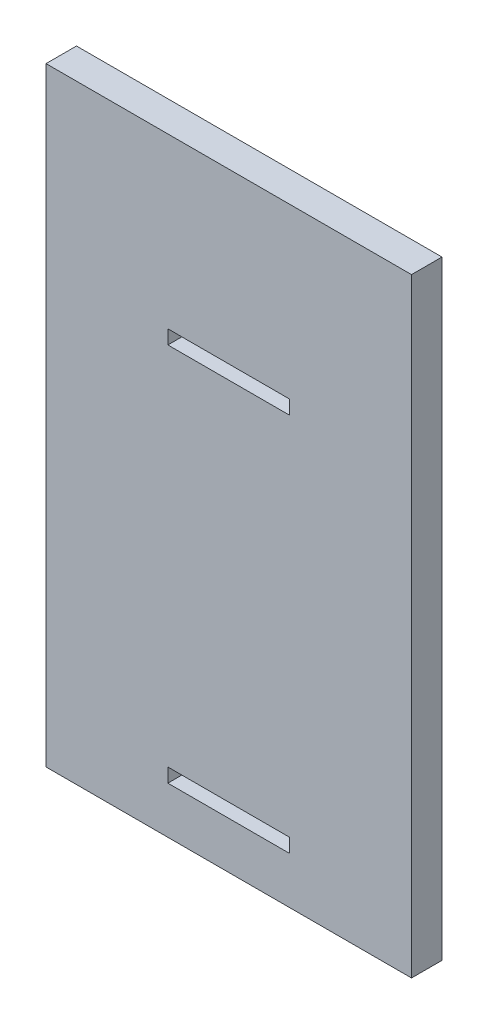
ISO-10303-21;
HEADER;
FILE_DESCRIPTION(('STEP AP214'),'2;1');
FILE_NAME('part.step','',(''),(''),'','','');
FILE_SCHEMA(('AUTOMOTIVE_DESIGN { 1 0 10303 214 1 1 1 1 }'));
ENDSEC;
DATA;
#1=APPLICATION_CONTEXT('core data for automotive mechanical design processes');
#2=APPLICATION_PROTOCOL_DEFINITION('international standard','automotive_design',2000,#1);
#3=PRODUCT_CONTEXT('',#1,'mechanical');
#4=PRODUCT('Part','Part','',(#3));
#5=PRODUCT_RELATED_PRODUCT_CATEGORY('part','',(#4));
#6=PRODUCT_DEFINITION_FORMATION('','',#4);
#7=PRODUCT_DEFINITION_CONTEXT('part definition',#1,'design');
#8=PRODUCT_DEFINITION('design','',#6,#7);
#9=PRODUCT_DEFINITION_SHAPE('','',#8);
#10=(LENGTH_UNIT() NAMED_UNIT(*) SI_UNIT(.MILLI.,.METRE.));
#11=(NAMED_UNIT(*) PLANE_ANGLE_UNIT() SI_UNIT($,.RADIAN.));
#12=(NAMED_UNIT(*) SI_UNIT($,.STERADIAN.) SOLID_ANGLE_UNIT());
#13=UNCERTAINTY_MEASURE_WITH_UNIT(LENGTH_MEASURE(1.E-05),#10,'distance_accuracy_value','');
#14=(GEOMETRIC_REPRESENTATION_CONTEXT(3) GLOBAL_UNCERTAINTY_ASSIGNED_CONTEXT((#13)) GLOBAL_UNIT_ASSIGNED_CONTEXT((#10,
#11,#12)) REPRESENTATION_CONTEXT('',''));
#15=CARTESIAN_POINT('',(0.,0.,0.));
#16=DIRECTION('',(0.,0.,1.));
#17=DIRECTION('',(1.,0.,0.));
#18=AXIS2_PLACEMENT_3D('',#15,#16,#17);
#19=CARTESIAN_POINT('',(0.,0.,0.125));
#20=DIRECTION('',(0.,0.,-1.));
#21=DIRECTION('',(-1.,0.,0.));
#22=AXIS2_PLACEMENT_3D('',#19,#20,#21);
#23=PLANE('',#22);
#24=DIRECTION('',(0.,-1.,0.));
#25=VECTOR('',#24,1.);
#26=CARTESIAN_POINT('',(1.,3.615,0.125));
#27=LINE('',#26,#25);
#28=CARTESIAN_POINT('',(1.,3.615,0.125));
#29=VERTEX_POINT('',#28);
#30=CARTESIAN_POINT('',(1.,3.5,0.125));
#31=VERTEX_POINT('',#30);
#32=EDGE_CURVE('E202',#29,#31,#27,.T.);
#33=ORIENTED_EDGE('',*,*,#32,.F.);
#34=DIRECTION('',(-1.,0.,0.));
#35=VECTOR('',#34,1.);
#36=CARTESIAN_POINT('',(1.,3.615,0.125));
#37=LINE('',#36,#35);
#38=CARTESIAN_POINT('',(2.,3.615,0.125));
#39=VERTEX_POINT('',#38);
#40=EDGE_CURVE('E213',#39,#29,#37,.T.);
#41=ORIENTED_EDGE('',*,*,#40,.F.);
#42=DIRECTION('',(0.,1.,0.));
#43=VECTOR('',#42,1.);
#44=CARTESIAN_POINT('',(2.,3.615,0.125));
#45=LINE('',#44,#43);
#46=CARTESIAN_POINT('',(2.,3.5,0.125));
#47=VERTEX_POINT('',#46);
#48=EDGE_CURVE('E209',#47,#39,#45,.T.);
#49=ORIENTED_EDGE('',*,*,#48,.F.);
#50=DIRECTION('',(1.,0.,0.));
#51=VECTOR('',#50,1.);
#52=CARTESIAN_POINT('',(1.,3.5,0.125));
#53=LINE('',#52,#51);
#54=EDGE_CURVE('E205',#31,#47,#53,.T.);
#55=ORIENTED_EDGE('',*,*,#54,.F.);
#56=EDGE_LOOP('',(#33,#41,#49,#55));
#57=FACE_BOUND('',#56,.T.);
#58=DIRECTION('',(0.,-1.,0.));
#59=VECTOR('',#58,1.);
#60=CARTESIAN_POINT('',(0.,0.,0.125));
#61=LINE('',#60,#59);
#62=CARTESIAN_POINT('',(0.,5.,0.125));
#63=VERTEX_POINT('',#62);
#64=CARTESIAN_POINT('',(0.,0.,0.125));
#65=VERTEX_POINT('',#64);
#66=EDGE_CURVE('E245',#63,#65,#61,.T.);
#67=ORIENTED_EDGE('',*,*,#66,.T.);
#68=DIRECTION('',(1.,0.,0.));
#69=VECTOR('',#68,1.);
#70=CARTESIAN_POINT('',(0.,0.,0.125));
#71=LINE('',#70,#69);
#72=CARTESIAN_POINT('',(3.,0.,0.125));
#73=VERTEX_POINT('',#72);
#74=EDGE_CURVE('E249',#65,#73,#71,.T.);
#75=ORIENTED_EDGE('',*,*,#74,.T.);
#76=DIRECTION('',(0.,1.,0.));
#77=VECTOR('',#76,1.);
#78=CARTESIAN_POINT('',(3.,0.,0.125));
#79=LINE('',#78,#77);
#80=CARTESIAN_POINT('',(3.,5.,0.125));
#81=VERTEX_POINT('',#80);
#82=EDGE_CURVE('E253',#73,#81,#79,.T.);
#83=ORIENTED_EDGE('',*,*,#82,.T.);
#84=DIRECTION('',(-1.,0.,0.));
#85=VECTOR('',#84,1.);
#86=CARTESIAN_POINT('',(0.,5.,0.125));
#87=LINE('',#86,#85);
#88=EDGE_CURVE('E255',#81,#63,#87,.T.);
#89=ORIENTED_EDGE('',*,*,#88,.T.);
#90=EDGE_LOOP('',(#67,#75,#83,#89));
#91=FACE_BOUND('',#90,.T.);
#92=DIRECTION('',(0.,-1.,0.));
#93=VECTOR('',#92,1.);
#94=CARTESIAN_POINT('',(1.,0.5,0.125));
#95=LINE('',#94,#93);
#96=CARTESIAN_POINT('',(1.,0.5,0.125));
#97=VERTEX_POINT('',#96);
#98=CARTESIAN_POINT('',(1.,0.385,0.125));
#99=VERTEX_POINT('',#98);
#100=EDGE_CURVE('E153',#97,#99,#95,.T.);
#101=ORIENTED_EDGE('',*,*,#100,.F.);
#102=DIRECTION('',(-1.,0.,0.));
#103=VECTOR('',#102,1.);
#104=CARTESIAN_POINT('',(1.,0.5,0.125));
#105=LINE('',#104,#103);
#106=CARTESIAN_POINT('',(2.,0.5,0.125));
#107=VERTEX_POINT('',#106);
#108=EDGE_CURVE('E181',#107,#97,#105,.T.);
#109=ORIENTED_EDGE('',*,*,#108,.F.);
#110=DIRECTION('',(0.,1.,0.));
#111=VECTOR('',#110,1.);
#112=CARTESIAN_POINT('',(2.,0.5,0.125));
#113=LINE('',#112,#111);
#114=CARTESIAN_POINT('',(2.,0.385,0.125));
#115=VERTEX_POINT('',#114);
#116=EDGE_CURVE('E175',#115,#107,#113,.T.);
#117=ORIENTED_EDGE('',*,*,#116,.F.);
#118=DIRECTION('',(1.,0.,0.));
#119=VECTOR('',#118,1.);
#120=CARTESIAN_POINT('',(1.,0.385,0.125));
#121=LINE('',#120,#119);
#122=EDGE_CURVE('E162',#99,#115,#121,.T.);
#123=ORIENTED_EDGE('',*,*,#122,.F.);
#124=EDGE_LOOP('',(#101,#109,#117,#123));
#125=FACE_BOUND('',#124,.T.);
#126=ADVANCED_FACE('F39',(#57,#91,#125),#23,.F.);
#127=CARTESIAN_POINT('',(0.,0.,-0.125));
#128=DIRECTION('',(0.,0.,-1.));
#129=DIRECTION('',(-1.,0.,0.));
#130=AXIS2_PLACEMENT_3D('',#127,#128,#129);
#131=PLANE('',#130);
#132=DIRECTION('',(0.,-1.,0.));
#133=VECTOR('',#132,1.);
#134=CARTESIAN_POINT('',(0.,0.,-0.125));
#135=LINE('',#134,#133);
#136=CARTESIAN_POINT('',(0.,5.,-0.125));
#137=VERTEX_POINT('',#136);
#138=CARTESIAN_POINT('',(0.,0.,-0.125));
#139=VERTEX_POINT('',#138);
#140=EDGE_CURVE('E244',#137,#139,#135,.T.);
#141=ORIENTED_EDGE('',*,*,#140,.F.);
#142=DIRECTION('',(-1.,0.,0.));
#143=VECTOR('',#142,1.);
#144=CARTESIAN_POINT('',(0.,5.,-0.125));
#145=LINE('',#144,#143);
#146=CARTESIAN_POINT('',(3.,5.,-0.125));
#147=VERTEX_POINT('',#146);
#148=EDGE_CURVE('E250',#147,#137,#145,.T.);
#149=ORIENTED_EDGE('',*,*,#148,.F.);
#150=DIRECTION('',(0.,1.,0.));
#151=VECTOR('',#150,1.);
#152=CARTESIAN_POINT('',(3.,0.,-0.125));
#153=LINE('',#152,#151);
#154=CARTESIAN_POINT('',(3.,0.,-0.125));
#155=VERTEX_POINT('',#154);
#156=EDGE_CURVE('E265',#155,#147,#153,.T.);
#157=ORIENTED_EDGE('',*,*,#156,.F.);
#158=DIRECTION('',(1.,0.,0.));
#159=VECTOR('',#158,1.);
#160=CARTESIAN_POINT('',(0.,0.,-0.125));
#161=LINE('',#160,#159);
#162=EDGE_CURVE('E262',#139,#155,#161,.T.);
#163=ORIENTED_EDGE('',*,*,#162,.F.);
#164=EDGE_LOOP('',(#141,#149,#157,#163));
#165=FACE_BOUND('',#164,.T.);
#166=DIRECTION('',(-1.,0.,0.));
#167=VECTOR('',#166,1.);
#168=CARTESIAN_POINT('',(1.,3.615,-0.125));
#169=LINE('',#168,#167);
#170=CARTESIAN_POINT('',(2.,3.615,-0.125));
#171=VERTEX_POINT('',#170);
#172=CARTESIAN_POINT('',(1.,3.615,-0.125));
#173=VERTEX_POINT('',#172);
#174=EDGE_CURVE('E206',#171,#173,#169,.T.);
#175=ORIENTED_EDGE('',*,*,#174,.T.);
#176=DIRECTION('',(0.,-1.,0.));
#177=VECTOR('',#176,1.);
#178=CARTESIAN_POINT('',(1.,3.615,-0.125));
#179=LINE('',#178,#177);
#180=CARTESIAN_POINT('',(1.,3.5,-0.125));
#181=VERTEX_POINT('',#180);
#182=EDGE_CURVE('E171',#173,#181,#179,.T.);
#183=ORIENTED_EDGE('',*,*,#182,.T.);
#184=DIRECTION('',(1.,0.,0.));
#185=VECTOR('',#184,1.);
#186=CARTESIAN_POINT('',(1.,3.5,-0.125));
#187=LINE('',#186,#185);
#188=CARTESIAN_POINT('',(2.,3.5,-0.125));
#189=VERTEX_POINT('',#188);
#190=EDGE_CURVE('E220',#181,#189,#187,.T.);
#191=ORIENTED_EDGE('',*,*,#190,.T.);
#192=DIRECTION('',(0.,1.,0.));
#193=VECTOR('',#192,1.);
#194=CARTESIAN_POINT('',(2.,3.615,-0.125));
#195=LINE('',#194,#193);
#196=EDGE_CURVE('E224',#189,#171,#195,.T.);
#197=ORIENTED_EDGE('',*,*,#196,.T.);
#198=EDGE_LOOP('',(#175,#183,#191,#197));
#199=FACE_BOUND('',#198,.T.);
#200=DIRECTION('',(-1.,0.,0.));
#201=VECTOR('',#200,1.);
#202=CARTESIAN_POINT('',(1.,0.5,-0.125));
#203=LINE('',#202,#201);
#204=CARTESIAN_POINT('',(2.,0.5,-0.125));
#205=VERTEX_POINT('',#204);
#206=CARTESIAN_POINT('',(1.,0.5,-0.125));
#207=VERTEX_POINT('',#206);
#208=EDGE_CURVE('E163',#205,#207,#203,.T.);
#209=ORIENTED_EDGE('',*,*,#208,.T.);
#210=DIRECTION('',(0.,-1.,0.));
#211=VECTOR('',#210,1.);
#212=CARTESIAN_POINT('',(1.,0.5,-0.125));
#213=LINE('',#212,#211);
#214=CARTESIAN_POINT('',(1.,0.385,-0.125));
#215=VERTEX_POINT('',#214);
#216=EDGE_CURVE('E69',#207,#215,#213,.T.);
#217=ORIENTED_EDGE('',*,*,#216,.T.);
#218=DIRECTION('',(1.,0.,0.));
#219=VECTOR('',#218,1.);
#220=CARTESIAN_POINT('',(1.,0.385,-0.125));
#221=LINE('',#220,#219);
#222=CARTESIAN_POINT('',(2.,0.385,-0.125));
#223=VERTEX_POINT('',#222);
#224=EDGE_CURVE('E169',#215,#223,#221,.T.);
#225=ORIENTED_EDGE('',*,*,#224,.T.);
#226=DIRECTION('',(0.,1.,0.));
#227=VECTOR('',#226,1.);
#228=CARTESIAN_POINT('',(2.,0.5,-0.125));
#229=LINE('',#228,#227);
#230=EDGE_CURVE('E189',#223,#205,#229,.T.);
#231=ORIENTED_EDGE('',*,*,#230,.T.);
#232=EDGE_LOOP('',(#209,#217,#225,#231));
#233=FACE_BOUND('',#232,.T.);
#234=ADVANCED_FACE('F288',(#165,#199,#233),#131,.T.);
#235=CARTESIAN_POINT('',(0.,0.,0.125));
#236=DIRECTION('',(1.,0.,0.));
#237=DIRECTION('',(0.,0.,-1.));
#238=AXIS2_PLACEMENT_3D('',#235,#236,#237);
#239=PLANE('',#238);
#240=ORIENTED_EDGE('',*,*,#140,.T.);
#241=DIRECTION('',(0.,0.,-1.));
#242=VECTOR('',#241,1.);
#243=CARTESIAN_POINT('',(0.,0.,0.125));
#244=LINE('',#243,#242);
#245=EDGE_CURVE('E11',#65,#139,#244,.T.);
#246=ORIENTED_EDGE('',*,*,#245,.F.);
#247=ORIENTED_EDGE('',*,*,#66,.F.);
#248=DIRECTION('',(0.,0.,-1.));
#249=VECTOR('',#248,1.);
#250=CARTESIAN_POINT('',(0.,5.,0.125));
#251=LINE('',#250,#249);
#252=EDGE_CURVE('E258',#63,#137,#251,.T.);
#253=ORIENTED_EDGE('',*,*,#252,.T.);
#254=EDGE_LOOP('',(#240,#246,#247,#253));
#255=FACE_BOUND('',#254,.T.);
#256=ADVANCED_FACE('F41',(#255),#239,.F.);
#257=CARTESIAN_POINT('',(0.,0.,0.125));
#258=DIRECTION('',(0.,1.,0.));
#259=DIRECTION('',(0.,0.,1.));
#260=AXIS2_PLACEMENT_3D('',#257,#258,#259);
#261=PLANE('',#260);
#262=ORIENTED_EDGE('',*,*,#162,.T.);
#263=DIRECTION('',(0.,0.,-1.));
#264=VECTOR('',#263,1.);
#265=CARTESIAN_POINT('',(3.,0.,0.125));
#266=LINE('',#265,#264);
#267=EDGE_CURVE('E48',#73,#155,#266,.T.);
#268=ORIENTED_EDGE('',*,*,#267,.F.);
#269=ORIENTED_EDGE('',*,*,#74,.F.);
#270=ORIENTED_EDGE('',*,*,#245,.T.);
#271=EDGE_LOOP('',(#262,#268,#269,#270));
#272=FACE_BOUND('',#271,.T.);
#273=ADVANCED_FACE('F298',(#272),#261,.F.);
#274=CARTESIAN_POINT('',(3.,0.,0.125));
#275=DIRECTION('',(-1.,0.,0.));
#276=DIRECTION('',(0.,0.,1.));
#277=AXIS2_PLACEMENT_3D('',#274,#275,#276);
#278=PLANE('',#277);
#279=ORIENTED_EDGE('',*,*,#156,.T.);
#280=DIRECTION('',(0.,0.,-1.));
#281=VECTOR('',#280,1.);
#282=CARTESIAN_POINT('',(3.,5.,0.125));
#283=LINE('',#282,#281);
#284=EDGE_CURVE('E273',#81,#147,#283,.T.);
#285=ORIENTED_EDGE('',*,*,#284,.F.);
#286=ORIENTED_EDGE('',*,*,#82,.F.);
#287=ORIENTED_EDGE('',*,*,#267,.T.);
#288=EDGE_LOOP('',(#279,#285,#286,#287));
#289=FACE_BOUND('',#288,.T.);
#290=ADVANCED_FACE('F282',(#289),#278,.F.);
#291=CARTESIAN_POINT('',(0.,5.,0.125));
#292=DIRECTION('',(0.,-1.,0.));
#293=DIRECTION('',(0.,0.,-1.));
#294=AXIS2_PLACEMENT_3D('',#291,#292,#293);
#295=PLANE('',#294);
#296=ORIENTED_EDGE('',*,*,#148,.T.);
#297=ORIENTED_EDGE('',*,*,#252,.F.);
#298=ORIENTED_EDGE('',*,*,#88,.F.);
#299=ORIENTED_EDGE('',*,*,#284,.T.);
#300=EDGE_LOOP('',(#296,#297,#298,#299));
#301=FACE_BOUND('',#300,.T.);
#302=ADVANCED_FACE('F292',(#301),#295,.F.);
#303=CARTESIAN_POINT('',(1.,3.615,0.125));
#304=DIRECTION('',(1.,0.,0.));
#305=DIRECTION('',(0.,1.,0.));
#306=AXIS2_PLACEMENT_3D('',#303,#304,#305);
#307=PLANE('',#306);
#308=ORIENTED_EDGE('',*,*,#182,.F.);
#309=DIRECTION('',(0.,0.,-1.));
#310=VECTOR('',#309,1.);
#311=CARTESIAN_POINT('',(1.,3.615,0.125));
#312=LINE('',#311,#310);
#313=EDGE_CURVE('E216',#29,#173,#312,.T.);
#314=ORIENTED_EDGE('',*,*,#313,.F.);
#315=ORIENTED_EDGE('',*,*,#32,.T.);
#316=DIRECTION('',(0.,0.,-1.));
#317=VECTOR('',#316,1.);
#318=CARTESIAN_POINT('',(1.,3.5,0.125));
#319=LINE('',#318,#317);
#320=EDGE_CURVE('E240',#31,#181,#319,.T.);
#321=ORIENTED_EDGE('',*,*,#320,.T.);
#322=EDGE_LOOP('',(#308,#314,#315,#321));
#323=FACE_BOUND('',#322,.T.);
#324=ADVANCED_FACE('F314',(#323),#307,.T.);
#325=CARTESIAN_POINT('',(1.,3.5,0.125));
#326=DIRECTION('',(0.,1.,0.));
#327=DIRECTION('',(0.,0.,1.));
#328=AXIS2_PLACEMENT_3D('',#325,#326,#327);
#329=PLANE('',#328);
#330=ORIENTED_EDGE('',*,*,#190,.F.);
#331=ORIENTED_EDGE('',*,*,#320,.F.);
#332=ORIENTED_EDGE('',*,*,#54,.T.);
#333=DIRECTION('',(0.,0.,-1.));
#334=VECTOR('',#333,1.);
#335=CARTESIAN_POINT('',(2.,3.5,0.125));
#336=LINE('',#335,#334);
#337=EDGE_CURVE('E237',#47,#189,#336,.T.);
#338=ORIENTED_EDGE('',*,*,#337,.T.);
#339=EDGE_LOOP('',(#330,#331,#332,#338));
#340=FACE_BOUND('',#339,.T.);
#341=ADVANCED_FACE('F321',(#340),#329,.T.);
#342=CARTESIAN_POINT('',(2.,3.615,0.125));
#343=DIRECTION('',(-1.,0.,0.));
#344=DIRECTION('',(0.,-1.,0.));
#345=AXIS2_PLACEMENT_3D('',#342,#343,#344);
#346=PLANE('',#345);
#347=ORIENTED_EDGE('',*,*,#196,.F.);
#348=ORIENTED_EDGE('',*,*,#337,.F.);
#349=ORIENTED_EDGE('',*,*,#48,.T.);
#350=DIRECTION('',(0.,0.,-1.));
#351=VECTOR('',#350,1.);
#352=CARTESIAN_POINT('',(2.,3.615,0.125));
#353=LINE('',#352,#351);
#354=EDGE_CURVE('E234',#39,#171,#353,.T.);
#355=ORIENTED_EDGE('',*,*,#354,.T.);
#356=EDGE_LOOP('',(#347,#348,#349,#355));
#357=FACE_BOUND('',#356,.T.);
#358=ADVANCED_FACE('F326',(#357),#346,.T.);
#359=CARTESIAN_POINT('',(1.,3.615,0.125));
#360=DIRECTION('',(0.,-1.,0.));
#361=DIRECTION('',(0.,0.,-1.));
#362=AXIS2_PLACEMENT_3D('',#359,#360,#361);
#363=PLANE('',#362);
#364=ORIENTED_EDGE('',*,*,#174,.F.);
#365=ORIENTED_EDGE('',*,*,#354,.F.);
#366=ORIENTED_EDGE('',*,*,#40,.T.);
#367=ORIENTED_EDGE('',*,*,#313,.T.);
#368=EDGE_LOOP('',(#364,#365,#366,#367));
#369=FACE_BOUND('',#368,.T.);
#370=ADVANCED_FACE('F332',(#369),#363,.T.);
#371=CARTESIAN_POINT('',(1.,0.5,0.125));
#372=DIRECTION('',(1.,0.,0.));
#373=DIRECTION('',(0.,0.,-1.));
#374=AXIS2_PLACEMENT_3D('',#371,#372,#373);
#375=PLANE('',#374);
#376=ORIENTED_EDGE('',*,*,#216,.F.);
#377=DIRECTION('',(0.,0.,-1.));
#378=VECTOR('',#377,1.);
#379=CARTESIAN_POINT('',(1.,0.5,0.125));
#380=LINE('',#379,#378);
#381=EDGE_CURVE('E157',#97,#207,#380,.T.);
#382=ORIENTED_EDGE('',*,*,#381,.F.);
#383=ORIENTED_EDGE('',*,*,#100,.T.);
#384=DIRECTION('',(0.,0.,-1.));
#385=VECTOR('',#384,1.);
#386=CARTESIAN_POINT('',(1.,0.385,0.125));
#387=LINE('',#386,#385);
#388=EDGE_CURVE('E156',#99,#215,#387,.T.);
#389=ORIENTED_EDGE('',*,*,#388,.T.);
#390=EDGE_LOOP('',(#376,#382,#383,#389));
#391=FACE_BOUND('',#390,.T.);
#392=ADVANCED_FACE('F155',(#391),#375,.T.);
#393=CARTESIAN_POINT('',(1.,0.385,0.125));
#394=DIRECTION('',(0.,1.,0.));
#395=DIRECTION('',(0.,0.,1.));
#396=AXIS2_PLACEMENT_3D('',#393,#394,#395);
#397=PLANE('',#396);
#398=ORIENTED_EDGE('',*,*,#224,.F.);
#399=ORIENTED_EDGE('',*,*,#388,.F.);
#400=ORIENTED_EDGE('',*,*,#122,.T.);
#401=DIRECTION('',(0.,0.,-1.));
#402=VECTOR('',#401,1.);
#403=CARTESIAN_POINT('',(2.,0.385,0.125));
#404=LINE('',#403,#402);
#405=EDGE_CURVE('E172',#115,#223,#404,.T.);
#406=ORIENTED_EDGE('',*,*,#405,.T.);
#407=EDGE_LOOP('',(#398,#399,#400,#406));
#408=FACE_BOUND('',#407,.T.);
#409=ADVANCED_FACE('F166',(#408),#397,.T.);
#410=CARTESIAN_POINT('',(2.,0.5,0.125));
#411=DIRECTION('',(-1.,0.,0.));
#412=DIRECTION('',(0.,0.,1.));
#413=AXIS2_PLACEMENT_3D('',#410,#411,#412);
#414=PLANE('',#413);
#415=ORIENTED_EDGE('',*,*,#230,.F.);
#416=ORIENTED_EDGE('',*,*,#405,.F.);
#417=ORIENTED_EDGE('',*,*,#116,.T.);
#418=DIRECTION('',(0.,0.,-1.));
#419=VECTOR('',#418,1.);
#420=CARTESIAN_POINT('',(2.,0.5,0.125));
#421=LINE('',#420,#419);
#422=EDGE_CURVE('E58',#107,#205,#421,.T.);
#423=ORIENTED_EDGE('',*,*,#422,.T.);
#424=EDGE_LOOP('',(#415,#416,#417,#423));
#425=FACE_BOUND('',#424,.T.);
#426=ADVANCED_FACE('F351',(#425),#414,.T.);
#427=CARTESIAN_POINT('',(1.,0.5,0.125));
#428=DIRECTION('',(0.,-1.,0.));
#429=DIRECTION('',(0.,0.,-1.));
#430=AXIS2_PLACEMENT_3D('',#427,#428,#429);
#431=PLANE('',#430);
#432=ORIENTED_EDGE('',*,*,#208,.F.);
#433=ORIENTED_EDGE('',*,*,#422,.F.);
#434=ORIENTED_EDGE('',*,*,#108,.T.);
#435=ORIENTED_EDGE('',*,*,#381,.T.);
#436=EDGE_LOOP('',(#432,#433,#434,#435));
#437=FACE_BOUND('',#436,.T.);
#438=ADVANCED_FACE('F354',(#437),#431,.T.);
#439=CLOSED_SHELL('',(#126,#234,#256,#273,#290,#302,#324,#341,#358,#370,#392,#409,#426,#438));
#440=MANIFOLD_SOLID_BREP('B2',#439);
#441=ADVANCED_BREP_SHAPE_REPRESENTATION('',(#18,#440),#14);
#442=SHAPE_DEFINITION_REPRESENTATION(#9,#441);
ENDSEC;
END-ISO-10303-21;
